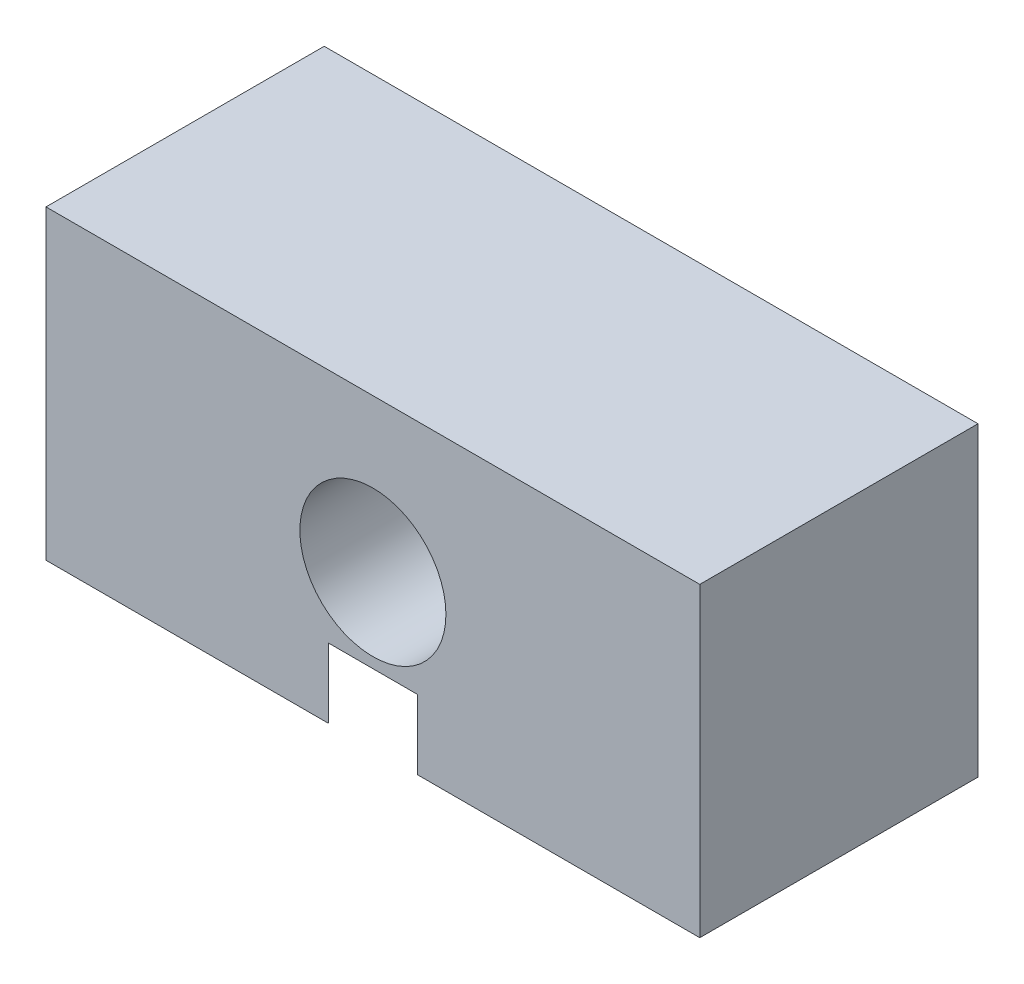
ISO-10303-21;
HEADER;
FILE_DESCRIPTION(('STEP AP214'),'2;1');
FILE_NAME('part.step','',(''),(''),'','','');
FILE_SCHEMA(('AUTOMOTIVE_DESIGN { 1 0 10303 214 1 1 1 1 }'));
ENDSEC;
DATA;
#1=APPLICATION_CONTEXT('core data for automotive mechanical design processes');
#2=APPLICATION_PROTOCOL_DEFINITION('international standard','automotive_design',2000,#1);
#3=PRODUCT_CONTEXT('',#1,'mechanical');
#4=PRODUCT('Part','Part','',(#3));
#5=PRODUCT_RELATED_PRODUCT_CATEGORY('part','',(#4));
#6=PRODUCT_DEFINITION_FORMATION('','',#4);
#7=PRODUCT_DEFINITION_CONTEXT('part definition',#1,'design');
#8=PRODUCT_DEFINITION('design','',#6,#7);
#9=PRODUCT_DEFINITION_SHAPE('','',#8);
#10=(LENGTH_UNIT() NAMED_UNIT(*) SI_UNIT(.MILLI.,.METRE.));
#11=(NAMED_UNIT(*) PLANE_ANGLE_UNIT() SI_UNIT($,.RADIAN.));
#12=(NAMED_UNIT(*) SI_UNIT($,.STERADIAN.) SOLID_ANGLE_UNIT());
#13=UNCERTAINTY_MEASURE_WITH_UNIT(LENGTH_MEASURE(1.E-05),#10,'distance_accuracy_value','');
#14=(GEOMETRIC_REPRESENTATION_CONTEXT(3) GLOBAL_UNCERTAINTY_ASSIGNED_CONTEXT((#13)) GLOBAL_UNIT_ASSIGNED_CONTEXT((#10,
#11,#12)) REPRESENTATION_CONTEXT('',''));
#15=CARTESIAN_POINT('',(0.,0.,0.));
#16=DIRECTION('',(0.,0.,1.));
#17=DIRECTION('',(1.,0.,0.));
#18=AXIS2_PLACEMENT_3D('',#15,#16,#17);
#19=CARTESIAN_POINT('',(-23.5,-11.,20.));
#20=DIRECTION('',(0.,1.,0.));
#21=DIRECTION('',(0.,0.,1.));
#22=AXIS2_PLACEMENT_3D('',#19,#20,#21);
#23=PLANE('',#22);
#24=DIRECTION('',(1.,0.,0.));
#25=VECTOR('',#24,1.);
#26=CARTESIAN_POINT('',(-23.5,-11.,0.));
#27=LINE('',#26,#25);
#28=CARTESIAN_POINT('',(-23.5,-11.,0.));
#29=VERTEX_POINT('',#28);
#30=CARTESIAN_POINT('',(-3.20156211871643,-11.,0.));
#31=VERTEX_POINT('',#30);
#32=EDGE_CURVE('E190',#29,#31,#27,.T.);
#33=ORIENTED_EDGE('',*,*,#32,.T.);
#34=CARTESIAN_POINT('',(0.,-11.,10.));
#35=DIRECTION('',(0.,-1.,0.));
#36=DIRECTION('',(0.,0.,-1.));
#37=AXIS2_PLACEMENT_3D('',#34,#35,#36);
#38=CIRCLE('',#37,10.5);
#39=CARTESIAN_POINT('',(-3.20156211871643,-11.,20.));
#40=VERTEX_POINT('',#39);
#41=EDGE_CURVE('E163',#40,#31,#38,.T.);
#42=ORIENTED_EDGE('',*,*,#41,.F.);
#43=DIRECTION('',(1.,0.,0.));
#44=VECTOR('',#43,1.);
#45=CARTESIAN_POINT('',(-23.5,-11.,20.));
#46=LINE('',#45,#44);
#47=CARTESIAN_POINT('',(-23.5,-11.,20.));
#48=VERTEX_POINT('',#47);
#49=EDGE_CURVE('E196',#48,#40,#46,.T.);
#50=ORIENTED_EDGE('',*,*,#49,.F.);
#51=DIRECTION('',(0.,0.,-1.));
#52=VECTOR('',#51,1.);
#53=CARTESIAN_POINT('',(-23.5,-11.,20.));
#54=LINE('',#53,#52);
#55=EDGE_CURVE('E215',#48,#29,#54,.T.);
#56=ORIENTED_EDGE('',*,*,#55,.T.);
#57=EDGE_LOOP('',(#33,#42,#50,#56));
#58=FACE_BOUND('',#57,.T.);
#59=ADVANCED_FACE('F39',(#58),#23,.F.);
#60=CARTESIAN_POINT('',(0.,0.,20.));
#61=DIRECTION('',(0.,0.,-1.));
#62=DIRECTION('',(-1.,0.,0.));
#63=AXIS2_PLACEMENT_3D('',#60,#61,#62);
#64=PLANE('',#63);
#65=ORIENTED_EDGE('',*,*,#49,.T.);
#66=DIRECTION('',(0.,-1.,0.));
#67=VECTOR('',#66,1.);
#68=CARTESIAN_POINT('',(-3.20156211871643,-6.,20.));
#69=LINE('',#68,#67);
#70=CARTESIAN_POINT('',(-3.20156211871643,-6.,20.));
#71=VERTEX_POINT('',#70);
#72=EDGE_CURVE('E233',#71,#40,#69,.T.);
#73=ORIENTED_EDGE('',*,*,#72,.F.);
#74=DIRECTION('',(-1.,0.,0.));
#75=VECTOR('',#74,1.);
#76=CARTESIAN_POINT('',(0.,-6.,20.));
#77=LINE('',#76,#75);
#78=CARTESIAN_POINT('',(3.20156211871643,-6.,20.));
#79=VERTEX_POINT('',#78);
#80=EDGE_CURVE('E174',#79,#71,#77,.T.);
#81=ORIENTED_EDGE('',*,*,#80,.F.);
#82=DIRECTION('',(0.,-1.,0.));
#83=VECTOR('',#82,1.);
#84=CARTESIAN_POINT('',(3.20156211871643,-6.,20.));
#85=LINE('',#84,#83);
#86=CARTESIAN_POINT('',(3.20156211871643,-11.,20.));
#87=VERTEX_POINT('',#86);
#88=EDGE_CURVE('E269',#79,#87,#85,.T.);
#89=ORIENTED_EDGE('',*,*,#88,.T.);
#90=CARTESIAN_POINT('',(23.5,-11.,20.));
#91=VERTEX_POINT('',#90);
#92=EDGE_CURVE('E64',#87,#91,#46,.T.);
#93=ORIENTED_EDGE('',*,*,#92,.T.);
#94=DIRECTION('',(0.,1.,0.));
#95=VECTOR('',#94,1.);
#96=CARTESIAN_POINT('',(23.5,-11.,20.));
#97=LINE('',#96,#95);
#98=CARTESIAN_POINT('',(23.5,11.,20.));
#99=VERTEX_POINT('',#98);
#100=EDGE_CURVE('E187',#91,#99,#97,.T.);
#101=ORIENTED_EDGE('',*,*,#100,.T.);
#102=DIRECTION('',(-1.,0.,0.));
#103=VECTOR('',#102,1.);
#104=CARTESIAN_POINT('',(-23.5,11.,20.));
#105=LINE('',#104,#103);
#106=CARTESIAN_POINT('',(-23.5,11.,20.));
#107=VERTEX_POINT('',#106);
#108=EDGE_CURVE('E92',#99,#107,#105,.T.);
#109=ORIENTED_EDGE('',*,*,#108,.T.);
#110=DIRECTION('',(0.,-1.,0.));
#111=VECTOR('',#110,1.);
#112=CARTESIAN_POINT('',(-23.5,-11.,20.));
#113=LINE('',#112,#111);
#114=EDGE_CURVE('E193',#107,#48,#113,.T.);
#115=ORIENTED_EDGE('',*,*,#114,.T.);
#116=EDGE_LOOP('',(#65,#73,#81,#89,#93,#101,#109,#115));
#117=FACE_BOUND('',#116,.T.);
#118=CARTESIAN_POINT('',(0.,0.,20.));
#119=DIRECTION('',(0.,0.,1.));
#120=DIRECTION('',(1.,0.,0.));
#121=AXIS2_PLACEMENT_3D('',#118,#119,#120);
#122=CIRCLE('',#121,5.25);
#123=CARTESIAN_POINT('',(5.25,0.,20.));
#124=VERTEX_POINT('',#123);
#125=EDGE_CURVE('E177',#124,#124,#122,.T.);
#126=ORIENTED_EDGE('',*,*,#125,.F.);
#127=EDGE_LOOP('',(#126));
#128=FACE_BOUND('',#127,.T.);
#129=ADVANCED_FACE('F230',(#117,#128),#64,.F.);
#130=CARTESIAN_POINT('',(0.,0.,0.));
#131=DIRECTION('',(0.,0.,-1.));
#132=DIRECTION('',(-1.,0.,0.));
#133=AXIS2_PLACEMENT_3D('',#130,#131,#132);
#134=PLANE('',#133);
#135=DIRECTION('',(0.,-1.,0.));
#136=VECTOR('',#135,1.);
#137=CARTESIAN_POINT('',(-3.20156211871643,-6.,0.));
#138=LINE('',#137,#136);
#139=CARTESIAN_POINT('',(-3.20156211871643,-6.,0.));
#140=VERTEX_POINT('',#139);
#141=EDGE_CURVE('E186',#140,#31,#138,.T.);
#142=ORIENTED_EDGE('',*,*,#141,.T.);
#143=ORIENTED_EDGE('',*,*,#32,.F.);
#144=DIRECTION('',(0.,-1.,0.));
#145=VECTOR('',#144,1.);
#146=CARTESIAN_POINT('',(-23.5,-11.,0.));
#147=LINE('',#146,#145);
#148=CARTESIAN_POINT('',(-23.5,11.,0.));
#149=VERTEX_POINT('',#148);
#150=EDGE_CURVE('E207',#149,#29,#147,.T.);
#151=ORIENTED_EDGE('',*,*,#150,.F.);
#152=DIRECTION('',(-1.,0.,0.));
#153=VECTOR('',#152,1.);
#154=CARTESIAN_POINT('',(-23.5,11.,0.));
#155=LINE('',#154,#153);
#156=CARTESIAN_POINT('',(23.5,11.,0.));
#157=VERTEX_POINT('',#156);
#158=EDGE_CURVE('E204',#157,#149,#155,.T.);
#159=ORIENTED_EDGE('',*,*,#158,.F.);
#160=DIRECTION('',(0.,1.,0.));
#161=VECTOR('',#160,1.);
#162=CARTESIAN_POINT('',(23.5,-11.,0.));
#163=LINE('',#162,#161);
#164=CARTESIAN_POINT('',(23.5,-11.,0.));
#165=VERTEX_POINT('',#164);
#166=EDGE_CURVE('E181',#165,#157,#163,.T.);
#167=ORIENTED_EDGE('',*,*,#166,.F.);
#168=CARTESIAN_POINT('',(3.20156211871643,-11.,0.));
#169=VERTEX_POINT('',#168);
#170=EDGE_CURVE('E85',#169,#165,#27,.T.);
#171=ORIENTED_EDGE('',*,*,#170,.F.);
#172=DIRECTION('',(0.,-1.,0.));
#173=VECTOR('',#172,1.);
#174=CARTESIAN_POINT('',(3.20156211871643,-6.,0.));
#175=LINE('',#174,#173);
#176=CARTESIAN_POINT('',(3.20156211871643,-6.,0.));
#177=VERTEX_POINT('',#176);
#178=EDGE_CURVE('E55',#177,#169,#175,.T.);
#179=ORIENTED_EDGE('',*,*,#178,.F.);
#180=DIRECTION('',(1.,0.,0.));
#181=VECTOR('',#180,1.);
#182=CARTESIAN_POINT('',(0.,-6.,0.));
#183=LINE('',#182,#181);
#184=EDGE_CURVE('E152',#140,#177,#183,.T.);
#185=ORIENTED_EDGE('',*,*,#184,.F.);
#186=EDGE_LOOP('',(#142,#143,#151,#159,#167,#171,#179,#185));
#187=FACE_BOUND('',#186,.T.);
#188=CARTESIAN_POINT('',(0.,0.,0.));
#189=DIRECTION('',(0.,0.,1.));
#190=DIRECTION('',(1.,0.,0.));
#191=AXIS2_PLACEMENT_3D('',#188,#189,#190);
#192=CIRCLE('',#191,5.25);
#193=CARTESIAN_POINT('',(5.25,0.,0.));
#194=VERTEX_POINT('',#193);
#195=EDGE_CURVE('E182',#194,#194,#192,.T.);
#196=ORIENTED_EDGE('',*,*,#195,.T.);
#197=EDGE_LOOP('',(#196));
#198=FACE_BOUND('',#197,.T.);
#199=ADVANCED_FACE('F165',(#187,#198),#134,.T.);
#200=CARTESIAN_POINT('',(23.5,-11.,20.));
#201=DIRECTION('',(-1.,0.,0.));
#202=DIRECTION('',(0.,0.,1.));
#203=AXIS2_PLACEMENT_3D('',#200,#201,#202);
#204=PLANE('',#203);
#205=ORIENTED_EDGE('',*,*,#166,.T.);
#206=DIRECTION('',(0.,0.,-1.));
#207=VECTOR('',#206,1.);
#208=CARTESIAN_POINT('',(23.5,11.,20.));
#209=LINE('',#208,#207);
#210=EDGE_CURVE('E11',#99,#157,#209,.T.);
#211=ORIENTED_EDGE('',*,*,#210,.F.);
#212=ORIENTED_EDGE('',*,*,#100,.F.);
#213=DIRECTION('',(0.,0.,-1.));
#214=VECTOR('',#213,1.);
#215=CARTESIAN_POINT('',(23.5,-11.,20.));
#216=LINE('',#215,#214);
#217=EDGE_CURVE('E200',#91,#165,#216,.T.);
#218=ORIENTED_EDGE('',*,*,#217,.T.);
#219=EDGE_LOOP('',(#205,#211,#212,#218));
#220=FACE_BOUND('',#219,.T.);
#221=ADVANCED_FACE('F41',(#220),#204,.F.);
#222=CARTESIAN_POINT('',(-23.5,11.,20.));
#223=DIRECTION('',(0.,-1.,0.));
#224=DIRECTION('',(0.,0.,-1.));
#225=AXIS2_PLACEMENT_3D('',#222,#223,#224);
#226=PLANE('',#225);
#227=ORIENTED_EDGE('',*,*,#158,.T.);
#228=DIRECTION('',(0.,0.,-1.));
#229=VECTOR('',#228,1.);
#230=CARTESIAN_POINT('',(-23.5,11.,20.));
#231=LINE('',#230,#229);
#232=EDGE_CURVE('E48',#107,#149,#231,.T.);
#233=ORIENTED_EDGE('',*,*,#232,.F.);
#234=ORIENTED_EDGE('',*,*,#108,.F.);
#235=ORIENTED_EDGE('',*,*,#210,.T.);
#236=EDGE_LOOP('',(#227,#233,#234,#235));
#237=FACE_BOUND('',#236,.T.);
#238=ADVANCED_FACE('F237',(#237),#226,.F.);
#239=CARTESIAN_POINT('',(-23.5,-11.,20.));
#240=DIRECTION('',(1.,0.,0.));
#241=DIRECTION('',(0.,0.,-1.));
#242=AXIS2_PLACEMENT_3D('',#239,#240,#241);
#243=PLANE('',#242);
#244=ORIENTED_EDGE('',*,*,#150,.T.);
#245=ORIENTED_EDGE('',*,*,#55,.F.);
#246=ORIENTED_EDGE('',*,*,#114,.F.);
#247=ORIENTED_EDGE('',*,*,#232,.T.);
#248=EDGE_LOOP('',(#244,#245,#246,#247));
#249=FACE_BOUND('',#248,.T.);
#250=ADVANCED_FACE('F223',(#249),#243,.F.);
#251=ORIENTED_EDGE('',*,*,#92,.F.);
#252=CARTESIAN_POINT('',(10.0048952523794,-11.,13.1862314713334));
#253=VERTEX_POINT('',#252);
#254=EDGE_CURVE('E262',#253,#87,#38,.T.);
#255=ORIENTED_EDGE('',*,*,#254,.F.);
#256=DIRECTION('',(0.,0.,1.));
#257=VECTOR('',#256,1.);
#258=CARTESIAN_POINT('',(10.0048952523794,-11.,0.));
#259=LINE('',#258,#257);
#260=CARTESIAN_POINT('',(10.0048952523794,-11.,13.537498662992));
#261=VERTEX_POINT('',#260);
#262=EDGE_CURVE('E287',#253,#261,#259,.T.);
#263=ORIENTED_EDGE('',*,*,#262,.T.);
#264=DIRECTION('',(1.,0.,0.));
#265=VECTOR('',#264,1.);
#266=CARTESIAN_POINT('',(0.,-11.,13.537498662992));
#267=LINE('',#266,#265);
#268=CARTESIAN_POINT('',(15.5669257364651,-11.,13.537498662992));
#269=VERTEX_POINT('',#268);
#270=EDGE_CURVE('E290',#261,#269,#267,.T.);
#271=ORIENTED_EDGE('',*,*,#270,.T.);
#272=DIRECTION('',(0.,0.,1.));
#273=VECTOR('',#272,1.);
#274=CARTESIAN_POINT('',(15.5669257364651,-11.,0.));
#275=LINE('',#274,#273);
#276=CARTESIAN_POINT('',(15.5669257364651,-11.,6.81376852866663));
#277=VERTEX_POINT('',#276);
#278=EDGE_CURVE('E294',#277,#269,#275,.T.);
#279=ORIENTED_EDGE('',*,*,#278,.F.);
#280=DIRECTION('',(1.,0.,0.));
#281=VECTOR('',#280,1.);
#282=CARTESIAN_POINT('',(0.,-11.,6.81376852866663));
#283=LINE('',#282,#281);
#284=CARTESIAN_POINT('',(10.0048952523794,-11.,6.81376852866663));
#285=VERTEX_POINT('',#284);
#286=EDGE_CURVE('E297',#285,#277,#283,.T.);
#287=ORIENTED_EDGE('',*,*,#286,.F.);
#288=EDGE_CURVE('E300',#169,#285,#38,.T.);
#289=ORIENTED_EDGE('',*,*,#288,.F.);
#290=ORIENTED_EDGE('',*,*,#170,.T.);
#291=ORIENTED_EDGE('',*,*,#217,.F.);
#292=EDGE_LOOP('',(#251,#255,#263,#271,#279,#287,#289,#290,#291));
#293=FACE_BOUND('',#292,.T.);
#294=ADVANCED_FACE('F243',(#293),#23,.F.);
#295=CARTESIAN_POINT('',(0.,0.,20.));
#296=DIRECTION('',(0.,0.,-1.));
#297=DIRECTION('',(-1.,0.,0.));
#298=AXIS2_PLACEMENT_3D('',#295,#296,#297);
#299=CYLINDRICAL_SURFACE('',#298,5.25);
#300=ORIENTED_EDGE('',*,*,#125,.T.);
#301=EDGE_LOOP('',(#300));
#302=FACE_BOUND('',#301,.T.);
#303=ORIENTED_EDGE('',*,*,#195,.F.);
#304=EDGE_LOOP('',(#303));
#305=FACE_BOUND('',#304,.T.);
#306=ADVANCED_FACE('F253',(#302,#305),#299,.F.);
#307=CARTESIAN_POINT('',(0.,-6.,10.));
#308=DIRECTION('',(0.,-1.,0.));
#309=DIRECTION('',(0.,0.,-1.));
#310=AXIS2_PLACEMENT_3D('',#307,#308,#309);
#311=CYLINDRICAL_SURFACE('',#310,10.5);
#312=ORIENTED_EDGE('',*,*,#41,.T.);
#313=ORIENTED_EDGE('',*,*,#141,.F.);
#314=CARTESIAN_POINT('',(0.,-6.,10.));
#315=DIRECTION('',(0.,-1.,0.));
#316=DIRECTION('',(0.,0.,-1.));
#317=AXIS2_PLACEMENT_3D('',#314,#315,#316);
#318=CIRCLE('',#317,10.5);
#319=EDGE_CURVE('E154',#71,#140,#318,.T.);
#320=ORIENTED_EDGE('',*,*,#319,.F.);
#321=ORIENTED_EDGE('',*,*,#72,.T.);
#322=EDGE_LOOP('',(#312,#313,#320,#321));
#323=FACE_BOUND('',#322,.T.);
#324=ADVANCED_FACE('F257',(#323),#311,.F.);
#325=ORIENTED_EDGE('',*,*,#254,.T.);
#326=ORIENTED_EDGE('',*,*,#88,.F.);
#327=CARTESIAN_POINT('',(10.0048952523794,-6.,13.1862314713334));
#328=VERTEX_POINT('',#327);
#329=EDGE_CURVE('E155',#328,#79,#318,.T.);
#330=ORIENTED_EDGE('',*,*,#329,.F.);
#331=DIRECTION('',(0.,-1.,0.));
#332=VECTOR('',#331,1.);
#333=CARTESIAN_POINT('',(10.0048952523794,-6.,13.1862314713334));
#334=LINE('',#333,#332);
#335=EDGE_CURVE('E272',#328,#253,#334,.T.);
#336=ORIENTED_EDGE('',*,*,#335,.T.);
#337=EDGE_LOOP('',(#325,#326,#330,#336));
#338=FACE_BOUND('',#337,.T.);
#339=ADVANCED_FACE('F332',(#338),#311,.F.);
#340=CARTESIAN_POINT('',(10.0048952523794,-6.,0.));
#341=DIRECTION('',(1.,0.,0.));
#342=DIRECTION('',(0.,0.,-1.));
#343=AXIS2_PLACEMENT_3D('',#340,#341,#342);
#344=PLANE('',#343);
#345=ORIENTED_EDGE('',*,*,#262,.F.);
#346=ORIENTED_EDGE('',*,*,#335,.F.);
#347=DIRECTION('',(0.,0.,1.));
#348=VECTOR('',#347,1.);
#349=CARTESIAN_POINT('',(10.0048952523794,-6.,0.));
#350=LINE('',#349,#348);
#351=CARTESIAN_POINT('',(10.0048952523794,-6.,13.537498662992));
#352=VERTEX_POINT('',#351);
#353=EDGE_CURVE('E305',#328,#352,#350,.T.);
#354=ORIENTED_EDGE('',*,*,#353,.T.);
#355=DIRECTION('',(0.,-1.,0.));
#356=VECTOR('',#355,1.);
#357=CARTESIAN_POINT('',(10.0048952523794,-6.,13.537498662992));
#358=LINE('',#357,#356);
#359=EDGE_CURVE('E275',#352,#261,#358,.T.);
#360=ORIENTED_EDGE('',*,*,#359,.T.);
#361=EDGE_LOOP('',(#345,#346,#354,#360));
#362=FACE_BOUND('',#361,.T.);
#363=ADVANCED_FACE('F343',(#362),#344,.T.);
#364=CARTESIAN_POINT('',(0.,-6.,13.537498662992));
#365=DIRECTION('',(0.,0.,-1.));
#366=DIRECTION('',(-1.,0.,0.));
#367=AXIS2_PLACEMENT_3D('',#364,#365,#366);
#368=PLANE('',#367);
#369=ORIENTED_EDGE('',*,*,#270,.F.);
#370=ORIENTED_EDGE('',*,*,#359,.F.);
#371=DIRECTION('',(1.,0.,0.));
#372=VECTOR('',#371,1.);
#373=CARTESIAN_POINT('',(0.,-6.,13.537498662992));
#374=LINE('',#373,#372);
#375=CARTESIAN_POINT('',(15.5669257364651,-6.,13.537498662992));
#376=VERTEX_POINT('',#375);
#377=EDGE_CURVE('E308',#352,#376,#374,.T.);
#378=ORIENTED_EDGE('',*,*,#377,.T.);
#379=DIRECTION('',(0.,-1.,0.));
#380=VECTOR('',#379,1.);
#381=CARTESIAN_POINT('',(15.5669257364651,-6.,13.537498662992));
#382=LINE('',#381,#380);
#383=EDGE_CURVE('E278',#376,#269,#382,.T.);
#384=ORIENTED_EDGE('',*,*,#383,.T.);
#385=EDGE_LOOP('',(#369,#370,#378,#384));
#386=FACE_BOUND('',#385,.T.);
#387=ADVANCED_FACE('F325',(#386),#368,.T.);
#388=CARTESIAN_POINT('',(15.5669257364651,-6.,0.));
#389=DIRECTION('',(1.,0.,0.));
#390=DIRECTION('',(0.,0.,-1.));
#391=AXIS2_PLACEMENT_3D('',#388,#389,#390);
#392=PLANE('',#391);
#393=ORIENTED_EDGE('',*,*,#278,.T.);
#394=ORIENTED_EDGE('',*,*,#383,.F.);
#395=DIRECTION('',(0.,0.,1.));
#396=VECTOR('',#395,1.);
#397=CARTESIAN_POINT('',(15.5669257364651,-6.,0.));
#398=LINE('',#397,#396);
#399=CARTESIAN_POINT('',(15.5669257364651,-6.,6.81376852866663));
#400=VERTEX_POINT('',#399);
#401=EDGE_CURVE('E311',#400,#376,#398,.T.);
#402=ORIENTED_EDGE('',*,*,#401,.F.);
#403=DIRECTION('',(0.,-1.,0.));
#404=VECTOR('',#403,1.);
#405=CARTESIAN_POINT('',(15.5669257364651,-6.,6.81376852866663));
#406=LINE('',#405,#404);
#407=EDGE_CURVE('E172',#400,#277,#406,.T.);
#408=ORIENTED_EDGE('',*,*,#407,.T.);
#409=EDGE_LOOP('',(#393,#394,#402,#408));
#410=FACE_BOUND('',#409,.T.);
#411=ADVANCED_FACE('F322',(#410),#392,.F.);
#412=CARTESIAN_POINT('',(0.,-6.,6.81376852866663));
#413=DIRECTION('',(0.,0.,-1.));
#414=DIRECTION('',(-1.,0.,0.));
#415=AXIS2_PLACEMENT_3D('',#412,#413,#414);
#416=PLANE('',#415);
#417=ORIENTED_EDGE('',*,*,#286,.T.);
#418=ORIENTED_EDGE('',*,*,#407,.F.);
#419=DIRECTION('',(1.,0.,0.));
#420=VECTOR('',#419,1.);
#421=CARTESIAN_POINT('',(0.,-6.,6.81376852866663));
#422=LINE('',#421,#420);
#423=CARTESIAN_POINT('',(10.0048952523794,-6.,6.81376852866663));
#424=VERTEX_POINT('',#423);
#425=EDGE_CURVE('E151',#424,#400,#422,.T.);
#426=ORIENTED_EDGE('',*,*,#425,.F.);
#427=DIRECTION('',(0.,-1.,0.));
#428=VECTOR('',#427,1.);
#429=CARTESIAN_POINT('',(10.0048952523794,-6.,6.81376852866663));
#430=LINE('',#429,#428);
#431=EDGE_CURVE('E146',#424,#285,#430,.T.);
#432=ORIENTED_EDGE('',*,*,#431,.T.);
#433=EDGE_LOOP('',(#417,#418,#426,#432));
#434=FACE_BOUND('',#433,.T.);
#435=ADVANCED_FACE('F318',(#434),#416,.F.);
#436=ORIENTED_EDGE('',*,*,#288,.T.);
#437=ORIENTED_EDGE('',*,*,#431,.F.);
#438=EDGE_CURVE('E143',#177,#424,#318,.T.);
#439=ORIENTED_EDGE('',*,*,#438,.F.);
#440=ORIENTED_EDGE('',*,*,#178,.T.);
#441=EDGE_LOOP('',(#436,#437,#439,#440));
#442=FACE_BOUND('',#441,.T.);
#443=ADVANCED_FACE('F145',(#442),#311,.F.);
#444=CARTESIAN_POINT('',(0.,-6.,0.));
#445=DIRECTION('',(0.,-1.,0.));
#446=DIRECTION('',(0.,0.,-1.));
#447=AXIS2_PLACEMENT_3D('',#444,#445,#446);
#448=PLANE('',#447);
#449=ORIENTED_EDGE('',*,*,#184,.T.);
#450=ORIENTED_EDGE('',*,*,#438,.T.);
#451=ORIENTED_EDGE('',*,*,#425,.T.);
#452=ORIENTED_EDGE('',*,*,#401,.T.);
#453=ORIENTED_EDGE('',*,*,#377,.F.);
#454=ORIENTED_EDGE('',*,*,#353,.F.);
#455=ORIENTED_EDGE('',*,*,#329,.T.);
#456=ORIENTED_EDGE('',*,*,#80,.T.);
#457=ORIENTED_EDGE('',*,*,#319,.T.);
#458=EDGE_LOOP('',(#449,#450,#451,#452,#453,#454,#455,#456,#457));
#459=FACE_BOUND('',#458,.T.);
#460=ADVANCED_FACE('F158',(#459),#448,.T.);
#461=CLOSED_SHELL('',(#59,#129,#199,#221,#238,#250,#294,#306,#324,#339,#363,#387,#411,#435,#443,#460));
#462=MANIFOLD_SOLID_BREP('B2',#461);
#463=ADVANCED_BREP_SHAPE_REPRESENTATION('',(#18,#462),#14);
#464=SHAPE_DEFINITION_REPRESENTATION(#9,#463);
ENDSEC;
END-ISO-10303-21;
